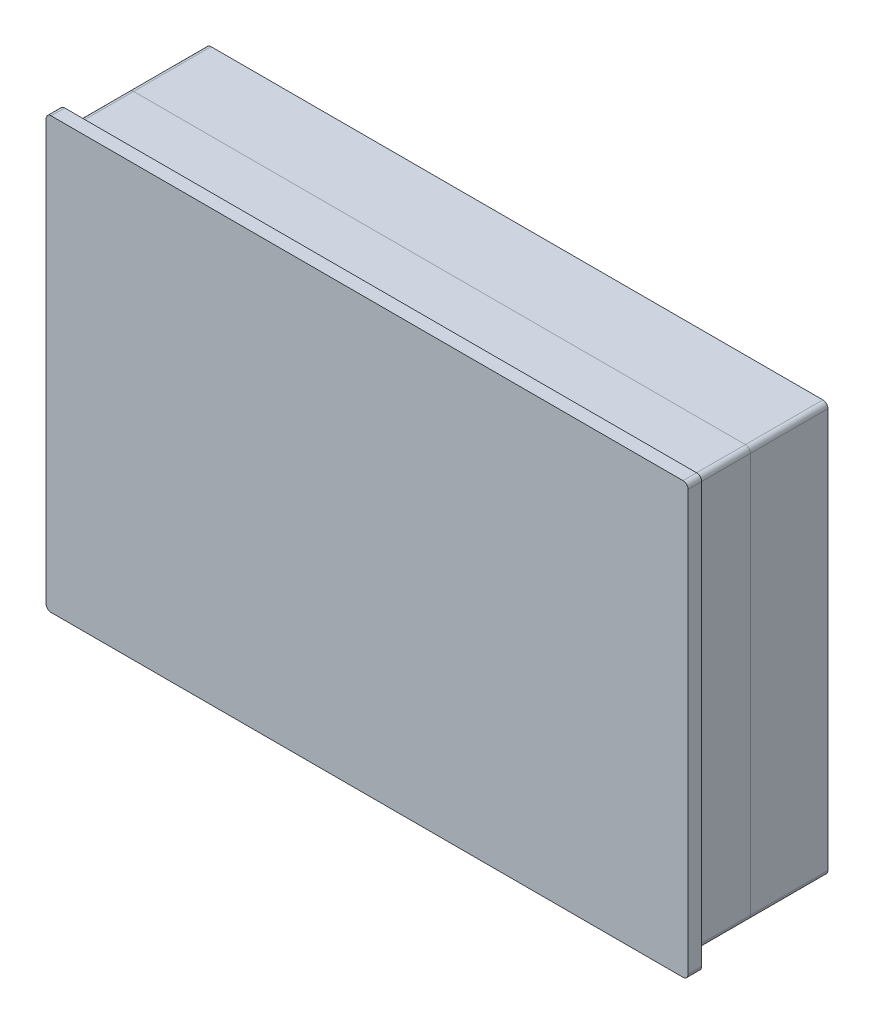
ISO-10303-21;
HEADER;
FILE_DESCRIPTION(('STEP AP214'),'2;1');
FILE_NAME('part.step','',(''),(''),'','','');
FILE_SCHEMA(('AUTOMOTIVE_DESIGN { 1 0 10303 214 1 1 1 1 }'));
ENDSEC;
DATA;
#1=APPLICATION_CONTEXT('core data for automotive mechanical design processes');
#2=APPLICATION_PROTOCOL_DEFINITION('international standard','automotive_design',2000,#1);
#3=PRODUCT_CONTEXT('',#1,'mechanical');
#4=PRODUCT('Part','Part','',(#3));
#5=PRODUCT_RELATED_PRODUCT_CATEGORY('part','',(#4));
#6=PRODUCT_DEFINITION_FORMATION('','',#4);
#7=PRODUCT_DEFINITION_CONTEXT('part definition',#1,'design');
#8=PRODUCT_DEFINITION('design','',#6,#7);
#9=PRODUCT_DEFINITION_SHAPE('','',#8);
#10=(LENGTH_UNIT() NAMED_UNIT(*) SI_UNIT(.MILLI.,.METRE.));
#11=(NAMED_UNIT(*) PLANE_ANGLE_UNIT() SI_UNIT($,.RADIAN.));
#12=(NAMED_UNIT(*) SI_UNIT($,.STERADIAN.) SOLID_ANGLE_UNIT());
#13=UNCERTAINTY_MEASURE_WITH_UNIT(LENGTH_MEASURE(1.E-05),#10,'distance_accuracy_value','');
#14=(GEOMETRIC_REPRESENTATION_CONTEXT(3) GLOBAL_UNCERTAINTY_ASSIGNED_CONTEXT((#13)) GLOBAL_UNIT_ASSIGNED_CONTEXT((#10,
#11,#12)) REPRESENTATION_CONTEXT('',''));
#15=CARTESIAN_POINT('',(0.,0.,0.));
#16=DIRECTION('',(0.,0.,1.));
#17=DIRECTION('',(1.,0.,0.));
#18=AXIS2_PLACEMENT_3D('',#15,#16,#17);
#19=CARTESIAN_POINT('',(-138.946382855201,-163.824841119516,-15.4));
#20=DIRECTION('',(1.,0.,0.));
#21=DIRECTION('',(0.,1.,0.));
#22=AXIS2_PLACEMENT_3D('',#19,#20,#21);
#23=PLANE('',#22);
#24=DIRECTION('',(0.,1.,0.));
#25=VECTOR('',#24,1.);
#26=CARTESIAN_POINT('',(-138.946382855201,-163.824841119516,-15.4));
#27=LINE('',#26,#25);
#28=CARTESIAN_POINT('',(-138.946382855201,-162.824841119516,-15.4));
#29=VERTEX_POINT('',#28);
#30=CARTESIAN_POINT('',(-138.946382855201,-83.3248411195161,-15.4));
#31=VERTEX_POINT('',#30);
#32=EDGE_CURVE('E137',#29,#31,#27,.T.);
#33=ORIENTED_EDGE('',*,*,#32,.F.);
#34=DIRECTION('',(0.,0.,1.));
#35=VECTOR('',#34,1.);
#36=CARTESIAN_POINT('',(-138.946382855201,-162.824841119516,-15.4));
#37=LINE('',#36,#35);
#38=CARTESIAN_POINT('',(-138.946382855201,-162.824841119516,0.));
#39=VERTEX_POINT('',#38);
#40=EDGE_CURVE('E163',#29,#39,#37,.T.);
#41=ORIENTED_EDGE('',*,*,#40,.T.);
#42=DIRECTION('',(0.,1.,0.));
#43=VECTOR('',#42,1.);
#44=CARTESIAN_POINT('',(-138.946382855201,-163.824841119516,0.));
#45=LINE('',#44,#43);
#46=CARTESIAN_POINT('',(-138.946382855201,-83.3248411195161,0.));
#47=VERTEX_POINT('',#46);
#48=EDGE_CURVE('E169',#39,#47,#45,.T.);
#49=ORIENTED_EDGE('',*,*,#48,.T.);
#50=DIRECTION('',(0.,0.,1.));
#51=VECTOR('',#50,1.);
#52=CARTESIAN_POINT('',(-138.946382855201,-83.3248411195161,-15.4));
#53=LINE('',#52,#51);
#54=EDGE_CURVE('E161',#47,#31,#53,.F.);
#55=ORIENTED_EDGE('',*,*,#54,.T.);
#56=EDGE_LOOP('',(#33,#41,#49,#55));
#57=FACE_BOUND('',#56,.T.);
#58=ADVANCED_FACE('F45',(#57),#23,.F.);
#59=CARTESIAN_POINT('',(-138.946382855201,-82.3248411195161,-15.4));
#60=DIRECTION('',(0.,-1.,0.));
#61=DIRECTION('',(0.,0.,-1.));
#62=AXIS2_PLACEMENT_3D('',#59,#60,#61);
#63=PLANE('',#62);
#64=DIRECTION('',(1.,0.,0.));
#65=VECTOR('',#64,1.);
#66=CARTESIAN_POINT('',(-138.946382855201,-82.3248411195161,-15.4));
#67=LINE('',#66,#65);
#68=CARTESIAN_POINT('',(-137.946382855201,-82.3248411195161,-15.4));
#69=VERTEX_POINT('',#68);
#70=CARTESIAN_POINT('',(-16.3463828552006,-82.3248411195161,-15.4));
#71=VERTEX_POINT('',#70);
#72=EDGE_CURVE('E140',#69,#71,#67,.T.);
#73=ORIENTED_EDGE('',*,*,#72,.F.);
#74=DIRECTION('',(0.,0.,1.));
#75=VECTOR('',#74,1.);
#76=CARTESIAN_POINT('',(-137.946382855201,-82.3248411195161,-15.4));
#77=LINE('',#76,#75);
#78=CARTESIAN_POINT('',(-137.946382855201,-82.3248411195161,0.));
#79=VERTEX_POINT('',#78);
#80=EDGE_CURVE('E12',#69,#79,#77,.T.);
#81=ORIENTED_EDGE('',*,*,#80,.T.);
#82=DIRECTION('',(1.,0.,0.));
#83=VECTOR('',#82,1.);
#84=CARTESIAN_POINT('',(-138.946382855201,-82.3248411195161,0.));
#85=LINE('',#84,#83);
#86=CARTESIAN_POINT('',(-16.3463828552006,-82.3248411195161,0.));
#87=VERTEX_POINT('',#86);
#88=EDGE_CURVE('E142',#79,#87,#85,.T.);
#89=ORIENTED_EDGE('',*,*,#88,.T.);
#90=DIRECTION('',(0.,0.,1.));
#91=VECTOR('',#90,1.);
#92=CARTESIAN_POINT('',(-16.3463828552006,-82.3248411195161,-15.4));
#93=LINE('',#92,#91);
#94=EDGE_CURVE('E53',#87,#71,#93,.F.);
#95=ORIENTED_EDGE('',*,*,#94,.T.);
#96=EDGE_LOOP('',(#73,#81,#89,#95));
#97=FACE_BOUND('',#96,.T.);
#98=ADVANCED_FACE('F188',(#97),#63,.F.);
#99=CARTESIAN_POINT('',(-15.3463828552006,-82.3248411195161,-15.4));
#100=DIRECTION('',(-1.,0.,0.));
#101=DIRECTION('',(0.,-1.,0.));
#102=AXIS2_PLACEMENT_3D('',#99,#100,#101);
#103=PLANE('',#102);
#104=DIRECTION('',(0.,-1.,0.));
#105=VECTOR('',#104,1.);
#106=CARTESIAN_POINT('',(-15.3463828552006,-82.3248411195161,0.));
#107=LINE('',#106,#105);
#108=CARTESIAN_POINT('',(-15.3463828552006,-83.3248411195161,0.));
#109=VERTEX_POINT('',#108);
#110=CARTESIAN_POINT('',(-15.3463828552006,-162.824841119516,0.));
#111=VERTEX_POINT('',#110);
#112=EDGE_CURVE('E138',#109,#111,#107,.T.);
#113=ORIENTED_EDGE('',*,*,#112,.T.);
#114=DIRECTION('',(0.,0.,1.));
#115=VECTOR('',#114,1.);
#116=CARTESIAN_POINT('',(-15.3463828552006,-162.824841119516,-15.4));
#117=LINE('',#116,#115);
#118=CARTESIAN_POINT('',(-15.3463828552006,-162.824841119516,-15.4));
#119=VERTEX_POINT('',#118);
#120=EDGE_CURVE('E116',#111,#119,#117,.F.);
#121=ORIENTED_EDGE('',*,*,#120,.T.);
#122=DIRECTION('',(0.,-1.,0.));
#123=VECTOR('',#122,1.);
#124=CARTESIAN_POINT('',(-15.3463828552006,-82.3248411195161,-15.4));
#125=LINE('',#124,#123);
#126=CARTESIAN_POINT('',(-15.3463828552006,-83.3248411195161,-15.4));
#127=VERTEX_POINT('',#126);
#128=EDGE_CURVE('E177',#127,#119,#125,.T.);
#129=ORIENTED_EDGE('',*,*,#128,.F.);
#130=DIRECTION('',(0.,0.,1.));
#131=VECTOR('',#130,1.);
#132=CARTESIAN_POINT('',(-15.3463828552006,-83.3248411195161,-15.4));
#133=LINE('',#132,#131);
#134=EDGE_CURVE('E121',#127,#109,#133,.T.);
#135=ORIENTED_EDGE('',*,*,#134,.T.);
#136=EDGE_LOOP('',(#113,#121,#129,#135));
#137=FACE_BOUND('',#136,.T.);
#138=ADVANCED_FACE('F187',(#137),#103,.F.);
#139=CARTESIAN_POINT('',(-15.3463828552006,-163.824841119516,-15.4));
#140=DIRECTION('',(0.,1.,0.));
#141=DIRECTION('',(0.,0.,1.));
#142=AXIS2_PLACEMENT_3D('',#139,#140,#141);
#143=PLANE('',#142);
#144=DIRECTION('',(-1.,0.,0.));
#145=VECTOR('',#144,1.);
#146=CARTESIAN_POINT('',(-15.3463828552006,-163.824841119516,-15.4));
#147=LINE('',#146,#145);
#148=CARTESIAN_POINT('',(-16.3463828552006,-163.824841119516,-15.4));
#149=VERTEX_POINT('',#148);
#150=CARTESIAN_POINT('',(-137.946382855201,-163.824841119516,-15.4));
#151=VERTEX_POINT('',#150);
#152=EDGE_CURVE('E131',#149,#151,#147,.T.);
#153=ORIENTED_EDGE('',*,*,#152,.F.);
#154=DIRECTION('',(0.,0.,1.));
#155=VECTOR('',#154,1.);
#156=CARTESIAN_POINT('',(-16.3463828552006,-163.824841119516,-15.4));
#157=LINE('',#156,#155);
#158=CARTESIAN_POINT('',(-16.3463828552006,-163.824841119516,0.));
#159=VERTEX_POINT('',#158);
#160=EDGE_CURVE('E115',#149,#159,#157,.T.);
#161=ORIENTED_EDGE('',*,*,#160,.T.);
#162=DIRECTION('',(-1.,0.,0.));
#163=VECTOR('',#162,1.);
#164=CARTESIAN_POINT('',(-15.3463828552006,-163.824841119516,0.));
#165=LINE('',#164,#163);
#166=CARTESIAN_POINT('',(-137.946382855201,-163.824841119516,0.));
#167=VERTEX_POINT('',#166);
#168=EDGE_CURVE('E128',#159,#167,#165,.T.);
#169=ORIENTED_EDGE('',*,*,#168,.T.);
#170=DIRECTION('',(0.,0.,1.));
#171=VECTOR('',#170,1.);
#172=CARTESIAN_POINT('',(-137.946382855201,-163.824841119516,-15.4));
#173=LINE('',#172,#171);
#174=EDGE_CURVE('E133',#167,#151,#173,.F.);
#175=ORIENTED_EDGE('',*,*,#174,.T.);
#176=EDGE_LOOP('',(#153,#161,#169,#175));
#177=FACE_BOUND('',#176,.T.);
#178=ADVANCED_FACE('F127',(#177),#143,.F.);
#179=CARTESIAN_POINT('',(0.,0.,-15.4));
#180=DIRECTION('',(0.,0.,-1.));
#181=DIRECTION('',(-1.,0.,0.));
#182=AXIS2_PLACEMENT_3D('',#179,#180,#181);
#183=PLANE('',#182);
#184=ORIENTED_EDGE('',*,*,#128,.T.);
#185=CARTESIAN_POINT('',(-16.3463828552006,-162.824841119516,-15.4));
#186=DIRECTION('',(0.,0.,-1.));
#187=DIRECTION('',(-1.,0.,0.));
#188=AXIS2_PLACEMENT_3D('',#185,#186,#187);
#189=CIRCLE('',#188,1.);
#190=EDGE_CURVE('E159',#119,#149,#189,.T.);
#191=ORIENTED_EDGE('',*,*,#190,.T.);
#192=ORIENTED_EDGE('',*,*,#152,.T.);
#193=CARTESIAN_POINT('',(-137.946382855201,-162.824841119516,-15.4));
#194=DIRECTION('',(0.,0.,-1.));
#195=DIRECTION('',(-1.,0.,0.));
#196=AXIS2_PLACEMENT_3D('',#193,#194,#195);
#197=CIRCLE('',#196,1.);
#198=EDGE_CURVE('E157',#151,#29,#197,.T.);
#199=ORIENTED_EDGE('',*,*,#198,.T.);
#200=ORIENTED_EDGE('',*,*,#32,.T.);
#201=CARTESIAN_POINT('',(-137.946382855201,-83.3248411195161,-15.4));
#202=DIRECTION('',(0.,0.,-1.));
#203=DIRECTION('',(-1.,0.,0.));
#204=AXIS2_PLACEMENT_3D('',#201,#202,#203);
#205=CIRCLE('',#204,1.);
#206=EDGE_CURVE('E66',#31,#69,#205,.T.);
#207=ORIENTED_EDGE('',*,*,#206,.T.);
#208=ORIENTED_EDGE('',*,*,#72,.T.);
#209=CARTESIAN_POINT('',(-16.3463828552006,-83.3248411195161,-15.4));
#210=DIRECTION('',(0.,0.,-1.));
#211=DIRECTION('',(-1.,0.,0.));
#212=AXIS2_PLACEMENT_3D('',#209,#210,#211);
#213=CIRCLE('',#212,1.);
#214=EDGE_CURVE('E154',#71,#127,#213,.T.);
#215=ORIENTED_EDGE('',*,*,#214,.T.);
#216=EDGE_LOOP('',(#184,#191,#192,#199,#200,#207,#208,#215));
#217=FACE_BOUND('',#216,.T.);
#218=ADVANCED_FACE('F181',(#217),#183,.T.);
#219=CARTESIAN_POINT('',(0.,0.,0.));
#220=DIRECTION('',(0.,0.,-1.));
#221=DIRECTION('',(-1.,0.,0.));
#222=AXIS2_PLACEMENT_3D('',#219,#220,#221);
#223=PLANE('',#222);
#224=ORIENTED_EDGE('',*,*,#168,.F.);
#225=CARTESIAN_POINT('',(-16.3463828552006,-162.824841119516,0.));
#226=DIRECTION('',(0.,0.,-1.));
#227=DIRECTION('',(-1.,0.,0.));
#228=AXIS2_PLACEMENT_3D('',#225,#226,#227);
#229=CIRCLE('',#228,1.);
#230=EDGE_CURVE('E111',#159,#111,#229,.F.);
#231=ORIENTED_EDGE('',*,*,#230,.T.);
#232=ORIENTED_EDGE('',*,*,#112,.F.);
#233=CARTESIAN_POINT('',(-16.3463828552006,-83.3248411195161,0.));
#234=DIRECTION('',(0.,0.,-1.));
#235=DIRECTION('',(-1.,0.,0.));
#236=AXIS2_PLACEMENT_3D('',#233,#234,#235);
#237=CIRCLE('',#236,1.);
#238=EDGE_CURVE('E132',#109,#87,#237,.F.);
#239=ORIENTED_EDGE('',*,*,#238,.T.);
#240=ORIENTED_EDGE('',*,*,#88,.F.);
#241=CARTESIAN_POINT('',(-137.946382855201,-83.3248411195161,0.));
#242=DIRECTION('',(0.,0.,-1.));
#243=DIRECTION('',(-1.,0.,0.));
#244=AXIS2_PLACEMENT_3D('',#241,#242,#243);
#245=CIRCLE('',#244,1.);
#246=EDGE_CURVE('E148',#79,#47,#245,.F.);
#247=ORIENTED_EDGE('',*,*,#246,.T.);
#248=ORIENTED_EDGE('',*,*,#48,.F.);
#249=CARTESIAN_POINT('',(-137.946382855201,-162.824841119516,0.));
#250=DIRECTION('',(0.,0.,-1.));
#251=DIRECTION('',(-1.,0.,0.));
#252=AXIS2_PLACEMENT_3D('',#249,#250,#251);
#253=CIRCLE('',#252,1.);
#254=EDGE_CURVE('E122',#39,#167,#253,.F.);
#255=ORIENTED_EDGE('',*,*,#254,.T.);
#256=EDGE_LOOP('',(#224,#231,#232,#239,#240,#247,#248,#255));
#257=FACE_BOUND('',#256,.T.);
#258=ADVANCED_FACE('F135',(#257),#223,.F.);
#259=CARTESIAN_POINT('',(-16.3463828552006,-162.824841119516,-15.4));
#260=DIRECTION('',(0.,0.,1.));
#261=DIRECTION('',(1.,0.,0.));
#262=AXIS2_PLACEMENT_3D('',#259,#260,#261);
#263=CYLINDRICAL_SURFACE('',#262,1.);
#264=ORIENTED_EDGE('',*,*,#190,.F.);
#265=ORIENTED_EDGE('',*,*,#120,.F.);
#266=ORIENTED_EDGE('',*,*,#230,.F.);
#267=ORIENTED_EDGE('',*,*,#160,.F.);
#268=EDGE_LOOP('',(#264,#265,#266,#267));
#269=FACE_BOUND('',#268,.T.);
#270=ADVANCED_FACE('F114',(#269),#263,.T.);
#271=CARTESIAN_POINT('',(-137.946382855201,-162.824841119516,-15.4));
#272=DIRECTION('',(0.,0.,1.));
#273=DIRECTION('',(1.,0.,0.));
#274=AXIS2_PLACEMENT_3D('',#271,#272,#273);
#275=CYLINDRICAL_SURFACE('',#274,1.);
#276=ORIENTED_EDGE('',*,*,#198,.F.);
#277=ORIENTED_EDGE('',*,*,#174,.F.);
#278=ORIENTED_EDGE('',*,*,#254,.F.);
#279=ORIENTED_EDGE('',*,*,#40,.F.);
#280=EDGE_LOOP('',(#276,#277,#278,#279));
#281=FACE_BOUND('',#280,.T.);
#282=ADVANCED_FACE('F191',(#281),#275,.T.);
#283=CARTESIAN_POINT('',(-137.946382855201,-83.3248411195161,-15.4));
#284=DIRECTION('',(0.,0.,1.));
#285=DIRECTION('',(1.,0.,0.));
#286=AXIS2_PLACEMENT_3D('',#283,#284,#285);
#287=CYLINDRICAL_SURFACE('',#286,1.);
#288=ORIENTED_EDGE('',*,*,#206,.F.);
#289=ORIENTED_EDGE('',*,*,#54,.F.);
#290=ORIENTED_EDGE('',*,*,#246,.F.);
#291=ORIENTED_EDGE('',*,*,#80,.F.);
#292=EDGE_LOOP('',(#288,#289,#290,#291));
#293=FACE_BOUND('',#292,.T.);
#294=ADVANCED_FACE('F190',(#293),#287,.T.);
#295=CARTESIAN_POINT('',(-16.3463828552006,-83.3248411195161,-15.4));
#296=DIRECTION('',(0.,0.,1.));
#297=DIRECTION('',(1.,0.,0.));
#298=AXIS2_PLACEMENT_3D('',#295,#296,#297);
#299=CYLINDRICAL_SURFACE('',#298,1.);
#300=ORIENTED_EDGE('',*,*,#214,.F.);
#301=ORIENTED_EDGE('',*,*,#94,.F.);
#302=ORIENTED_EDGE('',*,*,#238,.F.);
#303=ORIENTED_EDGE('',*,*,#134,.F.);
#304=EDGE_LOOP('',(#300,#301,#302,#303));
#305=FACE_BOUND('',#304,.T.);
#306=ADVANCED_FACE('F47',(#305),#299,.T.);
#307=CLOSED_SHELL('',(#58,#98,#138,#178,#218,#258,#270,#282,#294,#306));
#308=MANIFOLD_SOLID_BREP('B2',#307);
#309=CARTESIAN_POINT('',(-13.3463828552006,-80.3248411195161,14.4));
#310=DIRECTION('',(-1.,0.,0.));
#311=DIRECTION('',(0.,-1.,0.));
#312=AXIS2_PLACEMENT_3D('',#309,#310,#311);
#313=PLANE('',#312);
#314=DIRECTION('',(0.,-1.,0.));
#315=VECTOR('',#314,1.);
#316=CARTESIAN_POINT('',(-13.3463828552006,-80.3248411195161,11.7));
#317=LINE('',#316,#315);
#318=CARTESIAN_POINT('',(-13.3463828552006,-81.3248411195161,11.7));
#319=VERTEX_POINT('',#318);
#320=CARTESIAN_POINT('',(-13.3463828552006,-164.824841119516,11.7));
#321=VERTEX_POINT('',#320);
#322=EDGE_CURVE('E508',#319,#321,#317,.T.);
#323=ORIENTED_EDGE('',*,*,#322,.F.);
#324=DIRECTION('',(0.,0.,-1.));
#325=VECTOR('',#324,1.);
#326=CARTESIAN_POINT('',(-13.3463828552006,-81.3248411195161,14.4));
#327=LINE('',#326,#325);
#328=CARTESIAN_POINT('',(-13.3463828552006,-81.3248411195161,14.4));
#329=VERTEX_POINT('',#328);
#330=EDGE_CURVE('E453',#319,#329,#327,.F.);
#331=ORIENTED_EDGE('',*,*,#330,.T.);
#332=DIRECTION('',(0.,1.,0.));
#333=VECTOR('',#332,1.);
#334=CARTESIAN_POINT('',(-13.3463828552006,-80.3248411195161,14.4));
#335=LINE('',#334,#333);
#336=CARTESIAN_POINT('',(-13.3463828552006,-164.824841119516,14.4));
#337=VERTEX_POINT('',#336);
#338=EDGE_CURVE('E518',#337,#329,#335,.T.);
#339=ORIENTED_EDGE('',*,*,#338,.F.);
#340=DIRECTION('',(0.,0.,-1.));
#341=VECTOR('',#340,1.);
#342=CARTESIAN_POINT('',(-13.3463828552006,-164.824841119516,14.4));
#343=LINE('',#342,#341);
#344=EDGE_CURVE('E450',#337,#321,#343,.T.);
#345=ORIENTED_EDGE('',*,*,#344,.T.);
#346=EDGE_LOOP('',(#323,#331,#339,#345));
#347=FACE_BOUND('',#346,.T.);
#348=ADVANCED_FACE('F273',(#347),#313,.F.);
#349=CARTESIAN_POINT('',(-140.946382855201,-80.3248411195161,14.4));
#350=DIRECTION('',(0.,-1.,0.));
#351=DIRECTION('',(0.,0.,-1.));
#352=AXIS2_PLACEMENT_3D('',#349,#350,#351);
#353=PLANE('',#352);
#354=DIRECTION('',(-1.,0.,0.));
#355=VECTOR('',#354,1.);
#356=CARTESIAN_POINT('',(-140.946382855201,-80.3248411195161,14.4));
#357=LINE('',#356,#355);
#358=CARTESIAN_POINT('',(-14.3463828552006,-80.3248411195161,14.4));
#359=VERTEX_POINT('',#358);
#360=CARTESIAN_POINT('',(-139.946382855201,-80.3248411195161,14.4));
#361=VERTEX_POINT('',#360);
#362=EDGE_CURVE('E521',#359,#361,#357,.T.);
#363=ORIENTED_EDGE('',*,*,#362,.F.);
#364=DIRECTION('',(0.,0.,-1.));
#365=VECTOR('',#364,1.);
#366=CARTESIAN_POINT('',(-14.3463828552006,-80.3248411195161,14.4));
#367=LINE('',#366,#365);
#368=CARTESIAN_POINT('',(-14.3463828552006,-80.3248411195161,11.7));
#369=VERTEX_POINT('',#368);
#370=EDGE_CURVE('E439',#359,#369,#367,.T.);
#371=ORIENTED_EDGE('',*,*,#370,.T.);
#372=DIRECTION('',(1.,0.,0.));
#373=VECTOR('',#372,1.);
#374=CARTESIAN_POINT('',(-140.946382855201,-80.3248411195161,11.7));
#375=LINE('',#374,#373);
#376=CARTESIAN_POINT('',(-139.946382855201,-80.3248411195161,11.7));
#377=VERTEX_POINT('',#376);
#378=EDGE_CURVE('E505',#377,#369,#375,.T.);
#379=ORIENTED_EDGE('',*,*,#378,.F.);
#380=DIRECTION('',(0.,0.,-1.));
#381=VECTOR('',#380,1.);
#382=CARTESIAN_POINT('',(-139.946382855201,-80.3248411195161,14.4));
#383=LINE('',#382,#381);
#384=EDGE_CURVE('E437',#377,#361,#383,.F.);
#385=ORIENTED_EDGE('',*,*,#384,.T.);
#386=EDGE_LOOP('',(#363,#371,#379,#385));
#387=FACE_BOUND('',#386,.T.);
#388=ADVANCED_FACE('F549',(#387),#353,.F.);
#389=CARTESIAN_POINT('',(-140.946382855201,-80.3248411195161,14.4));
#390=DIRECTION('',(1.,0.,0.));
#391=DIRECTION('',(0.,1.,0.));
#392=AXIS2_PLACEMENT_3D('',#389,#390,#391);
#393=PLANE('',#392);
#394=DIRECTION('',(0.,1.,0.));
#395=VECTOR('',#394,1.);
#396=CARTESIAN_POINT('',(-140.946382855201,-165.824841119516,11.7));
#397=LINE('',#396,#395);
#398=CARTESIAN_POINT('',(-140.946382855201,-164.824841119516,11.7));
#399=VERTEX_POINT('',#398);
#400=CARTESIAN_POINT('',(-140.946382855201,-81.3248411195161,11.7));
#401=VERTEX_POINT('',#400);
#402=EDGE_CURVE('E515',#399,#401,#397,.T.);
#403=ORIENTED_EDGE('',*,*,#402,.F.);
#404=DIRECTION('',(0.,0.,-1.));
#405=VECTOR('',#404,1.);
#406=CARTESIAN_POINT('',(-140.946382855201,-164.824841119516,14.4));
#407=LINE('',#406,#405);
#408=CARTESIAN_POINT('',(-140.946382855201,-164.824841119516,14.4));
#409=VERTEX_POINT('',#408);
#410=EDGE_CURVE('E469',#399,#409,#407,.F.);
#411=ORIENTED_EDGE('',*,*,#410,.T.);
#412=DIRECTION('',(0.,-1.,0.));
#413=VECTOR('',#412,1.);
#414=CARTESIAN_POINT('',(-140.946382855201,-80.3248411195161,14.4));
#415=LINE('',#414,#413);
#416=CARTESIAN_POINT('',(-140.946382855201,-81.3248411195161,14.4));
#417=VERTEX_POINT('',#416);
#418=EDGE_CURVE('E414',#417,#409,#415,.T.);
#419=ORIENTED_EDGE('',*,*,#418,.F.);
#420=DIRECTION('',(0.,0.,-1.));
#421=VECTOR('',#420,1.);
#422=CARTESIAN_POINT('',(-140.946382855201,-81.3248411195161,14.4));
#423=LINE('',#422,#421);
#424=EDGE_CURVE('E466',#417,#401,#423,.T.);
#425=ORIENTED_EDGE('',*,*,#424,.T.);
#426=EDGE_LOOP('',(#403,#411,#419,#425));
#427=FACE_BOUND('',#426,.T.);
#428=ADVANCED_FACE('F552',(#427),#393,.F.);
#429=CARTESIAN_POINT('',(-140.946382855201,-165.824841119516,14.4));
#430=DIRECTION('',(0.,1.,0.));
#431=DIRECTION('',(0.,0.,1.));
#432=AXIS2_PLACEMENT_3D('',#429,#430,#431);
#433=PLANE('',#432);
#434=DIRECTION('',(-1.,0.,0.));
#435=VECTOR('',#434,1.);
#436=CARTESIAN_POINT('',(-13.3463828552006,-165.824841119516,11.7));
#437=LINE('',#436,#435);
#438=CARTESIAN_POINT('',(-14.3463828552006,-165.824841119516,11.7));
#439=VERTEX_POINT('',#438);
#440=CARTESIAN_POINT('',(-139.946382855201,-165.824841119516,11.7));
#441=VERTEX_POINT('',#440);
#442=EDGE_CURVE('E512',#439,#441,#437,.T.);
#443=ORIENTED_EDGE('',*,*,#442,.F.);
#444=DIRECTION('',(0.,0.,-1.));
#445=VECTOR('',#444,1.);
#446=CARTESIAN_POINT('',(-14.3463828552006,-165.824841119516,14.4));
#447=LINE('',#446,#445);
#448=CARTESIAN_POINT('',(-14.3463828552006,-165.824841119516,14.4));
#449=VERTEX_POINT('',#448);
#450=EDGE_CURVE('E288',#439,#449,#447,.F.);
#451=ORIENTED_EDGE('',*,*,#450,.T.);
#452=DIRECTION('',(1.,0.,0.));
#453=VECTOR('',#452,1.);
#454=CARTESIAN_POINT('',(-140.946382855201,-165.824841119516,14.4));
#455=LINE('',#454,#453);
#456=CARTESIAN_POINT('',(-139.946382855201,-165.824841119516,14.4));
#457=VERTEX_POINT('',#456);
#458=EDGE_CURVE('E411',#457,#449,#455,.T.);
#459=ORIENTED_EDGE('',*,*,#458,.F.);
#460=DIRECTION('',(0.,0.,-1.));
#461=VECTOR('',#460,1.);
#462=CARTESIAN_POINT('',(-139.946382855201,-165.824841119516,14.4));
#463=LINE('',#462,#461);
#464=EDGE_CURVE('E462',#457,#441,#463,.T.);
#465=ORIENTED_EDGE('',*,*,#464,.T.);
#466=EDGE_LOOP('',(#443,#451,#459,#465));
#467=FACE_BOUND('',#466,.T.);
#468=ADVANCED_FACE('F532',(#467),#433,.F.);
#469=CARTESIAN_POINT('',(0.,0.,14.4));
#470=DIRECTION('',(0.,0.,1.));
#471=DIRECTION('',(1.,0.,0.));
#472=AXIS2_PLACEMENT_3D('',#469,#470,#471);
#473=PLANE('',#472);
#474=ORIENTED_EDGE('',*,*,#338,.T.);
#475=CARTESIAN_POINT('',(-14.3463828552006,-81.3248411195161,14.4));
#476=DIRECTION('',(0.,0.,1.));
#477=DIRECTION('',(1.,0.,0.));
#478=AXIS2_PLACEMENT_3D('',#475,#476,#477);
#479=CIRCLE('',#478,1.);
#480=EDGE_CURVE('E460',#329,#359,#479,.T.);
#481=ORIENTED_EDGE('',*,*,#480,.T.);
#482=ORIENTED_EDGE('',*,*,#362,.T.);
#483=CARTESIAN_POINT('',(-139.946382855201,-81.3248411195161,14.4));
#484=DIRECTION('',(0.,0.,1.));
#485=DIRECTION('',(1.,0.,0.));
#486=AXIS2_PLACEMENT_3D('',#483,#484,#485);
#487=CIRCLE('',#486,1.);
#488=EDGE_CURVE('E455',#361,#417,#487,.T.);
#489=ORIENTED_EDGE('',*,*,#488,.T.);
#490=ORIENTED_EDGE('',*,*,#418,.T.);
#491=CARTESIAN_POINT('',(-139.946382855201,-164.824841119516,14.4));
#492=DIRECTION('',(0.,0.,1.));
#493=DIRECTION('',(1.,0.,0.));
#494=AXIS2_PLACEMENT_3D('',#491,#492,#493);
#495=CIRCLE('',#494,1.);
#496=EDGE_CURVE('E295',#409,#457,#495,.T.);
#497=ORIENTED_EDGE('',*,*,#496,.T.);
#498=ORIENTED_EDGE('',*,*,#458,.T.);
#499=CARTESIAN_POINT('',(-14.3463828552006,-164.824841119516,14.4));
#500=DIRECTION('',(0.,0.,1.));
#501=DIRECTION('',(1.,0.,0.));
#502=AXIS2_PLACEMENT_3D('',#499,#500,#501);
#503=CIRCLE('',#502,1.);
#504=EDGE_CURVE('E458',#449,#337,#503,.T.);
#505=ORIENTED_EDGE('',*,*,#504,.T.);
#506=EDGE_LOOP('',(#474,#481,#482,#489,#490,#497,#498,#505));
#507=FACE_BOUND('',#506,.T.);
#508=ADVANCED_FACE('F524',(#507),#473,.T.);
#509=CARTESIAN_POINT('',(0.,0.,11.7));
#510=DIRECTION('',(0.,0.,-1.));
#511=DIRECTION('',(-1.,0.,0.));
#512=AXIS2_PLACEMENT_3D('',#509,#510,#511);
#513=PLANE('',#512);
#514=DIRECTION('',(0.,1.,0.));
#515=VECTOR('',#514,1.);
#516=CARTESIAN_POINT('',(-138.946382855201,-163.824841119516,11.7));
#517=LINE('',#516,#515);
#518=CARTESIAN_POINT('',(-138.946382855201,-162.824841119516,11.7));
#519=VERTEX_POINT('',#518);
#520=CARTESIAN_POINT('',(-138.946382855201,-83.3248411195161,11.7));
#521=VERTEX_POINT('',#520);
#522=EDGE_CURVE('E509',#519,#521,#517,.T.);
#523=ORIENTED_EDGE('',*,*,#522,.F.);
#524=CARTESIAN_POINT('',(-137.946382855201,-162.824841119516,11.7));
#525=DIRECTION('',(0.,0.,-1.));
#526=DIRECTION('',(-1.,0.,0.));
#527=AXIS2_PLACEMENT_3D('',#524,#525,#526);
#528=CIRCLE('',#527,1.);
#529=CARTESIAN_POINT('',(-137.946382855201,-163.824841119516,11.7));
#530=VERTEX_POINT('',#529);
#531=EDGE_CURVE('E471',#519,#530,#528,.F.);
#532=ORIENTED_EDGE('',*,*,#531,.T.);
#533=DIRECTION('',(-1.,0.,0.));
#534=VECTOR('',#533,1.);
#535=CARTESIAN_POINT('',(-15.3463828552006,-163.824841119516,11.7));
#536=LINE('',#535,#534);
#537=CARTESIAN_POINT('',(-16.3463828552006,-163.824841119516,11.7));
#538=VERTEX_POINT('',#537);
#539=EDGE_CURVE('E714',#538,#530,#536,.T.);
#540=ORIENTED_EDGE('',*,*,#539,.F.);
#541=CARTESIAN_POINT('',(-16.3463828552006,-162.824841119516,11.7));
#542=DIRECTION('',(0.,0.,-1.));
#543=DIRECTION('',(-1.,0.,0.));
#544=AXIS2_PLACEMENT_3D('',#541,#542,#543);
#545=CIRCLE('',#544,1.);
#546=CARTESIAN_POINT('',(-15.3463828552006,-162.824841119516,11.7));
#547=VERTEX_POINT('',#546);
#548=EDGE_CURVE('E43',#538,#547,#545,.F.);
#549=ORIENTED_EDGE('',*,*,#548,.T.);
#550=DIRECTION('',(0.,-1.,0.));
#551=VECTOR('',#550,1.);
#552=CARTESIAN_POINT('',(-15.3463828552006,-82.3248411195161,11.7));
#553=LINE('',#552,#551);
#554=CARTESIAN_POINT('',(-15.3463828552006,-83.3248411195161,11.7));
#555=VERTEX_POINT('',#554);
#556=EDGE_CURVE('E485',#555,#547,#553,.T.);
#557=ORIENTED_EDGE('',*,*,#556,.F.);
#558=CARTESIAN_POINT('',(-16.3463828552006,-83.3248411195161,11.7));
#559=DIRECTION('',(0.,0.,-1.));
#560=DIRECTION('',(-1.,0.,0.));
#561=AXIS2_PLACEMENT_3D('',#558,#559,#560);
#562=CIRCLE('',#561,1.);
#563=CARTESIAN_POINT('',(-16.3463828552006,-82.3248411195161,11.7));
#564=VERTEX_POINT('',#563);
#565=EDGE_CURVE('E281',#555,#564,#562,.F.);
#566=ORIENTED_EDGE('',*,*,#565,.T.);
#567=DIRECTION('',(1.,0.,0.));
#568=VECTOR('',#567,1.);
#569=CARTESIAN_POINT('',(-138.946382855201,-82.3248411195161,11.7));
#570=LINE('',#569,#568);
#571=CARTESIAN_POINT('',(-137.946382855201,-82.3248411195161,11.7));
#572=VERTEX_POINT('',#571);
#573=EDGE_CURVE('E482',#572,#564,#570,.T.);
#574=ORIENTED_EDGE('',*,*,#573,.F.);
#575=CARTESIAN_POINT('',(-137.946382855201,-83.3248411195161,11.7));
#576=DIRECTION('',(0.,0.,-1.));
#577=DIRECTION('',(-1.,0.,0.));
#578=AXIS2_PLACEMENT_3D('',#575,#576,#577);
#579=CIRCLE('',#578,1.);
#580=EDGE_CURVE('E473',#572,#521,#579,.F.);
#581=ORIENTED_EDGE('',*,*,#580,.T.);
#582=EDGE_LOOP('',(#523,#532,#540,#549,#557,#566,#574,#581));
#583=FACE_BOUND('',#582,.T.);
#584=ORIENTED_EDGE('',*,*,#378,.T.);
#585=CARTESIAN_POINT('',(-14.3463828552006,-81.3248411195161,11.7));
#586=DIRECTION('',(0.,0.,-1.));
#587=DIRECTION('',(-1.,0.,0.));
#588=AXIS2_PLACEMENT_3D('',#585,#586,#587);
#589=CIRCLE('',#588,1.);
#590=EDGE_CURVE('E448',#369,#319,#589,.T.);
#591=ORIENTED_EDGE('',*,*,#590,.T.);
#592=ORIENTED_EDGE('',*,*,#322,.T.);
#593=CARTESIAN_POINT('',(-14.3463828552006,-164.824841119516,11.7));
#594=DIRECTION('',(0.,0.,-1.));
#595=DIRECTION('',(-1.,0.,0.));
#596=AXIS2_PLACEMENT_3D('',#593,#594,#595);
#597=CIRCLE('',#596,1.);
#598=EDGE_CURVE('E446',#321,#439,#597,.T.);
#599=ORIENTED_EDGE('',*,*,#598,.T.);
#600=ORIENTED_EDGE('',*,*,#442,.T.);
#601=CARTESIAN_POINT('',(-139.946382855201,-164.824841119516,11.7));
#602=DIRECTION('',(0.,0.,-1.));
#603=DIRECTION('',(-1.,0.,0.));
#604=AXIS2_PLACEMENT_3D('',#601,#602,#603);
#605=CIRCLE('',#604,1.);
#606=EDGE_CURVE('E444',#441,#399,#605,.T.);
#607=ORIENTED_EDGE('',*,*,#606,.T.);
#608=ORIENTED_EDGE('',*,*,#402,.T.);
#609=CARTESIAN_POINT('',(-139.946382855201,-81.3248411195161,11.7));
#610=DIRECTION('',(0.,0.,-1.));
#611=DIRECTION('',(-1.,0.,0.));
#612=AXIS2_PLACEMENT_3D('',#609,#610,#611);
#613=CIRCLE('',#612,1.);
#614=EDGE_CURVE('E442',#401,#377,#613,.T.);
#615=ORIENTED_EDGE('',*,*,#614,.T.);
#616=EDGE_LOOP('',(#584,#591,#592,#599,#600,#607,#608,#615));
#617=FACE_BOUND('',#616,.T.);
#618=ADVANCED_FACE('F480',(#583,#617),#513,.T.);
#619=CARTESIAN_POINT('',(-138.946382855201,-82.3248411195161,11.7));
#620=DIRECTION('',(0.,1.,0.));
#621=DIRECTION('',(0.,0.,1.));
#622=AXIS2_PLACEMENT_3D('',#619,#620,#621);
#623=PLANE('',#622);
#624=DIRECTION('',(1.,0.,0.));
#625=VECTOR('',#624,1.);
#626=CARTESIAN_POINT('',(-138.946382855201,-82.3248411195161,0.));
#627=LINE('',#626,#625);
#628=CARTESIAN_POINT('',(-137.946382855201,-82.3248411195161,0.));
#629=VERTEX_POINT('',#628);
#630=CARTESIAN_POINT('',(-16.3463828552006,-82.3248411195161,0.));
#631=VERTEX_POINT('',#630);
#632=EDGE_CURVE('E496',#629,#631,#627,.T.);
#633=ORIENTED_EDGE('',*,*,#632,.F.);
#634=DIRECTION('',(0.,0.,-1.));
#635=VECTOR('',#634,1.);
#636=CARTESIAN_POINT('',(-137.946382855201,-82.3248411195161,11.7));
#637=LINE('',#636,#635);
#638=EDGE_CURVE('E431',#629,#572,#637,.F.);
#639=ORIENTED_EDGE('',*,*,#638,.T.);
#640=ORIENTED_EDGE('',*,*,#573,.T.);
#641=DIRECTION('',(0.,0.,-1.));
#642=VECTOR('',#641,1.);
#643=CARTESIAN_POINT('',(-16.3463828552006,-82.3248411195161,11.7));
#644=LINE('',#643,#642);
#645=EDGE_CURVE('E428',#564,#631,#644,.T.);
#646=ORIENTED_EDGE('',*,*,#645,.T.);
#647=EDGE_LOOP('',(#633,#639,#640,#646));
#648=FACE_BOUND('',#647,.T.);
#649=ADVANCED_FACE('F491',(#648),#623,.T.);
#650=CARTESIAN_POINT('',(-138.946382855201,-163.824841119516,11.7));
#651=DIRECTION('',(-1.,0.,0.));
#652=DIRECTION('',(0.,-1.,0.));
#653=AXIS2_PLACEMENT_3D('',#650,#651,#652);
#654=PLANE('',#653);
#655=DIRECTION('',(0.,1.,0.));
#656=VECTOR('',#655,1.);
#657=CARTESIAN_POINT('',(-138.946382855201,-163.824841119516,0.));
#658=LINE('',#657,#656);
#659=CARTESIAN_POINT('',(-138.946382855201,-162.824841119516,0.));
#660=VERTEX_POINT('',#659);
#661=CARTESIAN_POINT('',(-138.946382855201,-83.3248411195161,0.));
#662=VERTEX_POINT('',#661);
#663=EDGE_CURVE('E407',#660,#662,#658,.T.);
#664=ORIENTED_EDGE('',*,*,#663,.F.);
#665=DIRECTION('',(0.,0.,-1.));
#666=VECTOR('',#665,1.);
#667=CARTESIAN_POINT('',(-138.946382855201,-162.824841119516,11.7));
#668=LINE('',#667,#666);
#669=EDGE_CURVE('E426',#660,#519,#668,.F.);
#670=ORIENTED_EDGE('',*,*,#669,.T.);
#671=ORIENTED_EDGE('',*,*,#522,.T.);
#672=DIRECTION('',(0.,0.,-1.));
#673=VECTOR('',#672,1.);
#674=CARTESIAN_POINT('',(-138.946382855201,-83.3248411195161,11.7));
#675=LINE('',#674,#673);
#676=EDGE_CURVE('E423',#521,#662,#675,.T.);
#677=ORIENTED_EDGE('',*,*,#676,.T.);
#678=EDGE_LOOP('',(#664,#670,#671,#677));
#679=FACE_BOUND('',#678,.T.);
#680=ADVANCED_FACE('F654',(#679),#654,.T.);
#681=CARTESIAN_POINT('',(-15.3463828552006,-163.824841119516,11.7));
#682=DIRECTION('',(0.,-1.,0.));
#683=DIRECTION('',(0.,0.,-1.));
#684=AXIS2_PLACEMENT_3D('',#681,#682,#683);
#685=PLANE('',#684);
#686=ORIENTED_EDGE('',*,*,#539,.T.);
#687=DIRECTION('',(0.,0.,-1.));
#688=VECTOR('',#687,1.);
#689=CARTESIAN_POINT('',(-137.946382855201,-163.824841119516,11.7));
#690=LINE('',#689,#688);
#691=CARTESIAN_POINT('',(-137.946382855201,-163.824841119516,0.));
#692=VERTEX_POINT('',#691);
#693=EDGE_CURVE('E398',#530,#692,#690,.T.);
#694=ORIENTED_EDGE('',*,*,#693,.T.);
#695=DIRECTION('',(-1.,0.,0.));
#696=VECTOR('',#695,1.);
#697=CARTESIAN_POINT('',(-15.3463828552006,-163.824841119516,0.));
#698=LINE('',#697,#696);
#699=CARTESIAN_POINT('',(-16.3463828552006,-163.824841119516,0.));
#700=VERTEX_POINT('',#699);
#701=EDGE_CURVE('E390',#700,#692,#698,.T.);
#702=ORIENTED_EDGE('',*,*,#701,.F.);
#703=DIRECTION('',(0.,0.,-1.));
#704=VECTOR('',#703,1.);
#705=CARTESIAN_POINT('',(-16.3463828552006,-163.824841119516,11.7));
#706=LINE('',#705,#704);
#707=EDGE_CURVE('E404',#700,#538,#706,.F.);
#708=ORIENTED_EDGE('',*,*,#707,.T.);
#709=EDGE_LOOP('',(#686,#694,#702,#708));
#710=FACE_BOUND('',#709,.T.);
#711=ADVANCED_FACE('F403',(#710),#685,.T.);
#712=CARTESIAN_POINT('',(-15.3463828552006,-82.3248411195161,11.7));
#713=DIRECTION('',(1.,0.,0.));
#714=DIRECTION('',(0.,1.,0.));
#715=AXIS2_PLACEMENT_3D('',#712,#713,#714);
#716=PLANE('',#715);
#717=DIRECTION('',(0.,-1.,0.));
#718=VECTOR('',#717,1.);
#719=CARTESIAN_POINT('',(-15.3463828552006,-82.3248411195161,0.));
#720=LINE('',#719,#718);
#721=CARTESIAN_POINT('',(-15.3463828552006,-83.3248411195161,0.));
#722=VERTEX_POINT('',#721);
#723=CARTESIAN_POINT('',(-15.3463828552006,-162.824841119516,0.));
#724=VERTEX_POINT('',#723);
#725=EDGE_CURVE('E392',#722,#724,#720,.T.);
#726=ORIENTED_EDGE('',*,*,#725,.F.);
#727=DIRECTION('',(0.,0.,-1.));
#728=VECTOR('',#727,1.);
#729=CARTESIAN_POINT('',(-15.3463828552006,-83.3248411195161,11.7));
#730=LINE('',#729,#728);
#731=EDGE_CURVE('E435',#722,#555,#730,.F.);
#732=ORIENTED_EDGE('',*,*,#731,.T.);
#733=ORIENTED_EDGE('',*,*,#556,.T.);
#734=DIRECTION('',(0.,0.,-1.));
#735=VECTOR('',#734,1.);
#736=CARTESIAN_POINT('',(-15.3463828552006,-162.824841119516,11.7));
#737=LINE('',#736,#735);
#738=EDGE_CURVE('E433',#547,#724,#737,.T.);
#739=ORIENTED_EDGE('',*,*,#738,.T.);
#740=EDGE_LOOP('',(#726,#732,#733,#739));
#741=FACE_BOUND('',#740,.T.);
#742=ADVANCED_FACE('F498',(#741),#716,.T.);
#743=CARTESIAN_POINT('',(0.,0.,0.));
#744=DIRECTION('',(0.,0.,1.));
#745=DIRECTION('',(1.,0.,0.));
#746=AXIS2_PLACEMENT_3D('',#743,#744,#745);
#747=PLANE('',#746);
#748=ORIENTED_EDGE('',*,*,#701,.T.);
#749=CARTESIAN_POINT('',(-137.946382855201,-162.824841119516,0.));
#750=DIRECTION('',(0.,0.,1.));
#751=DIRECTION('',(1.,0.,0.));
#752=AXIS2_PLACEMENT_3D('',#749,#750,#751);
#753=CIRCLE('',#752,1.);
#754=EDGE_CURVE('E421',#692,#660,#753,.F.);
#755=ORIENTED_EDGE('',*,*,#754,.T.);
#756=ORIENTED_EDGE('',*,*,#663,.T.);
#757=CARTESIAN_POINT('',(-137.946382855201,-83.3248411195161,0.));
#758=DIRECTION('',(0.,0.,1.));
#759=DIRECTION('',(1.,0.,0.));
#760=AXIS2_PLACEMENT_3D('',#757,#758,#759);
#761=CIRCLE('',#760,1.);
#762=EDGE_CURVE('E419',#662,#629,#761,.F.);
#763=ORIENTED_EDGE('',*,*,#762,.T.);
#764=ORIENTED_EDGE('',*,*,#632,.T.);
#765=CARTESIAN_POINT('',(-16.3463828552006,-83.3248411195161,0.));
#766=DIRECTION('',(0.,0.,1.));
#767=DIRECTION('',(1.,0.,0.));
#768=AXIS2_PLACEMENT_3D('',#765,#766,#767);
#769=CIRCLE('',#768,1.);
#770=EDGE_CURVE('E397',#631,#722,#769,.F.);
#771=ORIENTED_EDGE('',*,*,#770,.T.);
#772=ORIENTED_EDGE('',*,*,#725,.T.);
#773=CARTESIAN_POINT('',(-16.3463828552006,-162.824841119516,0.));
#774=DIRECTION('',(0.,0.,1.));
#775=DIRECTION('',(1.,0.,0.));
#776=AXIS2_PLACEMENT_3D('',#773,#774,#775);
#777=CIRCLE('',#776,1.);
#778=EDGE_CURVE('E387',#724,#700,#777,.F.);
#779=ORIENTED_EDGE('',*,*,#778,.T.);
#780=EDGE_LOOP('',(#748,#755,#756,#763,#764,#771,#772,#779));
#781=FACE_BOUND('',#780,.T.);
#782=ADVANCED_FACE('F389',(#781),#747,.F.);
#783=CARTESIAN_POINT('',(-137.946382855201,-162.824841119516,11.7));
#784=DIRECTION('',(0.,0.,-1.));
#785=DIRECTION('',(-1.,0.,0.));
#786=AXIS2_PLACEMENT_3D('',#783,#784,#785);
#787=CYLINDRICAL_SURFACE('',#786,1.);
#788=ORIENTED_EDGE('',*,*,#531,.F.);
#789=ORIENTED_EDGE('',*,*,#669,.F.);
#790=ORIENTED_EDGE('',*,*,#754,.F.);
#791=ORIENTED_EDGE('',*,*,#693,.F.);
#792=EDGE_LOOP('',(#788,#789,#790,#791));
#793=FACE_BOUND('',#792,.T.);
#794=ADVANCED_FACE('F566',(#793),#787,.T.);
#795=CARTESIAN_POINT('',(-137.946382855201,-83.3248411195161,11.7));
#796=DIRECTION('',(0.,0.,-1.));
#797=DIRECTION('',(-1.,0.,0.));
#798=AXIS2_PLACEMENT_3D('',#795,#796,#797);
#799=CYLINDRICAL_SURFACE('',#798,1.);
#800=ORIENTED_EDGE('',*,*,#580,.F.);
#801=ORIENTED_EDGE('',*,*,#638,.F.);
#802=ORIENTED_EDGE('',*,*,#762,.F.);
#803=ORIENTED_EDGE('',*,*,#676,.F.);
#804=EDGE_LOOP('',(#800,#801,#802,#803));
#805=FACE_BOUND('',#804,.T.);
#806=ADVANCED_FACE('F569',(#805),#799,.T.);
#807=CARTESIAN_POINT('',(-16.3463828552006,-83.3248411195161,11.7));
#808=DIRECTION('',(0.,0.,-1.));
#809=DIRECTION('',(-1.,0.,0.));
#810=AXIS2_PLACEMENT_3D('',#807,#808,#809);
#811=CYLINDRICAL_SURFACE('',#810,1.);
#812=ORIENTED_EDGE('',*,*,#565,.F.);
#813=ORIENTED_EDGE('',*,*,#731,.F.);
#814=ORIENTED_EDGE('',*,*,#770,.F.);
#815=ORIENTED_EDGE('',*,*,#645,.F.);
#816=EDGE_LOOP('',(#812,#813,#814,#815));
#817=FACE_BOUND('',#816,.T.);
#818=ADVANCED_FACE('F495',(#817),#811,.T.);
#819=CARTESIAN_POINT('',(-16.3463828552006,-162.824841119516,11.7));
#820=DIRECTION('',(0.,0.,-1.));
#821=DIRECTION('',(-1.,0.,0.));
#822=AXIS2_PLACEMENT_3D('',#819,#820,#821);
#823=CYLINDRICAL_SURFACE('',#822,1.);
#824=ORIENTED_EDGE('',*,*,#548,.F.);
#825=ORIENTED_EDGE('',*,*,#707,.F.);
#826=ORIENTED_EDGE('',*,*,#778,.F.);
#827=ORIENTED_EDGE('',*,*,#738,.F.);
#828=EDGE_LOOP('',(#824,#825,#826,#827));
#829=FACE_BOUND('',#828,.T.);
#830=ADVANCED_FACE('F410',(#829),#823,.T.);
#831=CARTESIAN_POINT('',(-14.3463828552006,-81.3248411195161,14.4));
#832=DIRECTION('',(0.,0.,-1.));
#833=DIRECTION('',(-1.,0.,0.));
#834=AXIS2_PLACEMENT_3D('',#831,#832,#833);
#835=CYLINDRICAL_SURFACE('',#834,1.);
#836=ORIENTED_EDGE('',*,*,#480,.F.);
#837=ORIENTED_EDGE('',*,*,#330,.F.);
#838=ORIENTED_EDGE('',*,*,#590,.F.);
#839=ORIENTED_EDGE('',*,*,#370,.F.);
#840=EDGE_LOOP('',(#836,#837,#838,#839));
#841=FACE_BOUND('',#840,.T.);
#842=ADVANCED_FACE('F546',(#841),#835,.T.);
#843=CARTESIAN_POINT('',(-14.3463828552006,-164.824841119516,14.4));
#844=DIRECTION('',(0.,0.,-1.));
#845=DIRECTION('',(-1.,0.,0.));
#846=AXIS2_PLACEMENT_3D('',#843,#844,#845);
#847=CYLINDRICAL_SURFACE('',#846,1.);
#848=ORIENTED_EDGE('',*,*,#504,.F.);
#849=ORIENTED_EDGE('',*,*,#450,.F.);
#850=ORIENTED_EDGE('',*,*,#598,.F.);
#851=ORIENTED_EDGE('',*,*,#344,.F.);
#852=EDGE_LOOP('',(#848,#849,#850,#851));
#853=FACE_BOUND('',#852,.T.);
#854=ADVANCED_FACE('F538',(#853),#847,.T.);
#855=CARTESIAN_POINT('',(-139.946382855201,-164.824841119516,14.4));
#856=DIRECTION('',(0.,0.,-1.));
#857=DIRECTION('',(-1.,0.,0.));
#858=AXIS2_PLACEMENT_3D('',#855,#856,#857);
#859=CYLINDRICAL_SURFACE('',#858,1.);
#860=ORIENTED_EDGE('',*,*,#496,.F.);
#861=ORIENTED_EDGE('',*,*,#410,.F.);
#862=ORIENTED_EDGE('',*,*,#606,.F.);
#863=ORIENTED_EDGE('',*,*,#464,.F.);
#864=EDGE_LOOP('',(#860,#861,#862,#863));
#865=FACE_BOUND('',#864,.T.);
#866=ADVANCED_FACE('F531',(#865),#859,.T.);
#867=CARTESIAN_POINT('',(-139.946382855201,-81.3248411195161,14.4));
#868=DIRECTION('',(0.,0.,-1.));
#869=DIRECTION('',(-1.,0.,0.));
#870=AXIS2_PLACEMENT_3D('',#867,#868,#869);
#871=CYLINDRICAL_SURFACE('',#870,1.);
#872=ORIENTED_EDGE('',*,*,#488,.F.);
#873=ORIENTED_EDGE('',*,*,#384,.F.);
#874=ORIENTED_EDGE('',*,*,#614,.F.);
#875=ORIENTED_EDGE('',*,*,#424,.F.);
#876=EDGE_LOOP('',(#872,#873,#874,#875));
#877=FACE_BOUND('',#876,.T.);
#878=ADVANCED_FACE('F275',(#877),#871,.T.);
#879=CLOSED_SHELL('',(#348,#388,#428,#468,#508,#618,#649,#680,#711,#742,#782,#794,#806,#818,
#830,#842,#854,#866,#878));
#880=MANIFOLD_SOLID_BREP('B6',#879);
#881=ADVANCED_BREP_SHAPE_REPRESENTATION('',(#18,#308,#880),#14);
#882=SHAPE_DEFINITION_REPRESENTATION(#9,#881);
ENDSEC;
END-ISO-10303-21;
